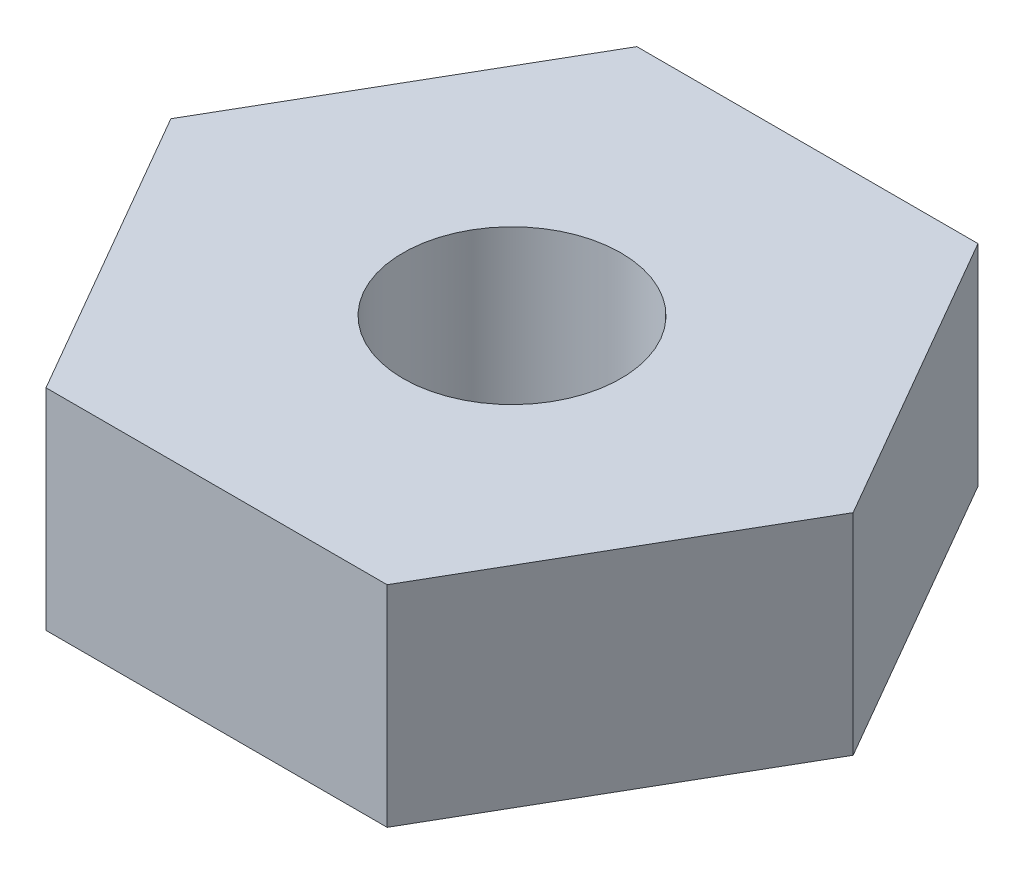
ISO-10303-21;
HEADER;
FILE_DESCRIPTION(('STEP AP214'),'2;1');
FILE_NAME('part.step','',(''),(''),'','','');
FILE_SCHEMA(('AUTOMOTIVE_DESIGN { 1 0 10303 214 1 1 1 1 }'));
ENDSEC;
DATA;
#1=APPLICATION_CONTEXT('core data for automotive mechanical design processes');
#2=APPLICATION_PROTOCOL_DEFINITION('international standard','automotive_design',2000,#1);
#3=PRODUCT_CONTEXT('',#1,'mechanical');
#4=PRODUCT('Part','Part','',(#3));
#5=PRODUCT_RELATED_PRODUCT_CATEGORY('part','',(#4));
#6=PRODUCT_DEFINITION_FORMATION('','',#4);
#7=PRODUCT_DEFINITION_CONTEXT('part definition',#1,'design');
#8=PRODUCT_DEFINITION('design','',#6,#7);
#9=PRODUCT_DEFINITION_SHAPE('','',#8);
#10=(LENGTH_UNIT() NAMED_UNIT(*) SI_UNIT(.MILLI.,.METRE.));
#11=(NAMED_UNIT(*) PLANE_ANGLE_UNIT() SI_UNIT($,.RADIAN.));
#12=(NAMED_UNIT(*) SI_UNIT($,.STERADIAN.) SOLID_ANGLE_UNIT());
#13=UNCERTAINTY_MEASURE_WITH_UNIT(LENGTH_MEASURE(1.E-05),#10,'distance_accuracy_value','');
#14=(GEOMETRIC_REPRESENTATION_CONTEXT(3) GLOBAL_UNCERTAINTY_ASSIGNED_CONTEXT((#13)) GLOBAL_UNIT_ASSIGNED_CONTEXT((#10,
#11,#12)) REPRESENTATION_CONTEXT('',''));
#15=CARTESIAN_POINT('',(0.,0.,0.));
#16=DIRECTION('',(0.,0.,1.));
#17=DIRECTION('',(1.,0.,0.));
#18=AXIS2_PLACEMENT_3D('',#15,#16,#17);
#19=CARTESIAN_POINT('',(2.24736479033408,2.7686,-3.89255));
#20=DIRECTION('',(0.,0.,1.));
#21=DIRECTION('',(1.,0.,0.));
#22=AXIS2_PLACEMENT_3D('',#19,#20,#21);
#23=PLANE('',#22);
#24=DIRECTION('',(-1.,0.,0.));
#25=VECTOR('',#24,1.);
#26=CARTESIAN_POINT('',(2.24736479033408,0.,-3.89255));
#27=LINE('',#26,#25);
#28=CARTESIAN_POINT('',(2.24736479033408,0.,-3.89255));
#29=VERTEX_POINT('',#28);
#30=CARTESIAN_POINT('',(-2.24736479033408,0.,-3.89255));
#31=VERTEX_POINT('',#30);
#32=EDGE_CURVE('E131',#29,#31,#27,.T.);
#33=ORIENTED_EDGE('',*,*,#32,.T.);
#34=DIRECTION('',(0.,-1.,0.));
#35=VECTOR('',#34,1.);
#36=CARTESIAN_POINT('',(-2.24736479033408,2.7686,-3.89255));
#37=LINE('',#36,#35);
#38=CARTESIAN_POINT('',(-2.24736479033408,2.7686,-3.89255));
#39=VERTEX_POINT('',#38);
#40=EDGE_CURVE('E13',#39,#31,#37,.T.);
#41=ORIENTED_EDGE('',*,*,#40,.F.);
#42=DIRECTION('',(-1.,0.,0.));
#43=VECTOR('',#42,1.);
#44=CARTESIAN_POINT('',(2.24736479033408,2.7686,-3.89255));
#45=LINE('',#44,#43);
#46=CARTESIAN_POINT('',(2.24736479033408,2.7686,-3.89255));
#47=VERTEX_POINT('',#46);
#48=EDGE_CURVE('E142',#47,#39,#45,.T.);
#49=ORIENTED_EDGE('',*,*,#48,.F.);
#50=DIRECTION('',(0.,-1.,0.));
#51=VECTOR('',#50,1.);
#52=CARTESIAN_POINT('',(2.24736479033408,2.7686,-3.89255));
#53=LINE('',#52,#51);
#54=EDGE_CURVE('E127',#47,#29,#53,.T.);
#55=ORIENTED_EDGE('',*,*,#54,.T.);
#56=EDGE_LOOP('',(#33,#41,#49,#55));
#57=FACE_BOUND('',#56,.T.);
#58=ADVANCED_FACE('F47',(#57),#23,.F.);
#59=CARTESIAN_POINT('',(-2.24736479033408,2.7686,-3.89255));
#60=DIRECTION('',(0.866025403784439,0.,0.5));
#61=DIRECTION('',(0.5,0.,-0.866025403784439));
#62=AXIS2_PLACEMENT_3D('',#59,#60,#61);
#63=PLANE('',#62);
#64=DIRECTION('',(-0.5,0.,0.866025403784439));
#65=VECTOR('',#64,1.);
#66=CARTESIAN_POINT('',(-2.24736479033408,0.,-3.89255));
#67=LINE('',#66,#65);
#68=CARTESIAN_POINT('',(-4.49472958066815,0.,0.));
#69=VERTEX_POINT('',#68);
#70=EDGE_CURVE('E134',#31,#69,#67,.T.);
#71=ORIENTED_EDGE('',*,*,#70,.T.);
#72=DIRECTION('',(0.,-1.,0.));
#73=VECTOR('',#72,1.);
#74=CARTESIAN_POINT('',(-4.49472958066815,2.7686,0.));
#75=LINE('',#74,#73);
#76=CARTESIAN_POINT('',(-4.49472958066815,2.7686,0.));
#77=VERTEX_POINT('',#76);
#78=EDGE_CURVE('E55',#77,#69,#75,.T.);
#79=ORIENTED_EDGE('',*,*,#78,.F.);
#80=DIRECTION('',(-0.5,0.,0.866025403784439));
#81=VECTOR('',#80,1.);
#82=CARTESIAN_POINT('',(-2.24736479033408,2.7686,-3.89255));
#83=LINE('',#82,#81);
#84=EDGE_CURVE('E100',#39,#77,#83,.T.);
#85=ORIENTED_EDGE('',*,*,#84,.F.);
#86=ORIENTED_EDGE('',*,*,#40,.T.);
#87=EDGE_LOOP('',(#71,#79,#85,#86));
#88=FACE_BOUND('',#87,.T.);
#89=ADVANCED_FACE('F167',(#88),#63,.F.);
#90=CARTESIAN_POINT('',(-4.49472958066815,2.7686,0.));
#91=DIRECTION('',(0.866025403784438,0.,-0.500000000000001));
#92=DIRECTION('',(-0.500000000000001,0.,-0.866025403784438));
#93=AXIS2_PLACEMENT_3D('',#90,#91,#92);
#94=PLANE('',#93);
#95=DIRECTION('',(0.500000000000001,0.,0.866025403784438));
#96=VECTOR('',#95,1.);
#97=CARTESIAN_POINT('',(-4.49472958066815,0.,0.));
#98=LINE('',#97,#96);
#99=CARTESIAN_POINT('',(-2.24736479033407,0.,3.89255));
#100=VERTEX_POINT('',#99);
#101=EDGE_CURVE('E137',#69,#100,#98,.T.);
#102=ORIENTED_EDGE('',*,*,#101,.T.);
#103=DIRECTION('',(0.,-1.,0.));
#104=VECTOR('',#103,1.);
#105=CARTESIAN_POINT('',(-2.24736479033407,2.7686,3.89255));
#106=LINE('',#105,#104);
#107=CARTESIAN_POINT('',(-2.24736479033407,2.7686,3.89255));
#108=VERTEX_POINT('',#107);
#109=EDGE_CURVE('E122',#108,#100,#106,.T.);
#110=ORIENTED_EDGE('',*,*,#109,.F.);
#111=DIRECTION('',(0.500000000000001,0.,0.866025403784438));
#112=VECTOR('',#111,1.);
#113=CARTESIAN_POINT('',(-4.49472958066815,2.7686,0.));
#114=LINE('',#113,#112);
#115=EDGE_CURVE('E113',#77,#108,#114,.T.);
#116=ORIENTED_EDGE('',*,*,#115,.F.);
#117=ORIENTED_EDGE('',*,*,#78,.T.);
#118=EDGE_LOOP('',(#102,#110,#116,#117));
#119=FACE_BOUND('',#118,.T.);
#120=ADVANCED_FACE('F148',(#119),#94,.F.);
#121=CARTESIAN_POINT('',(-2.24736479033407,2.7686,3.89255));
#122=DIRECTION('',(0.,0.,-1.));
#123=DIRECTION('',(-1.,0.,0.));
#124=AXIS2_PLACEMENT_3D('',#121,#122,#123);
#125=PLANE('',#124);
#126=DIRECTION('',(1.,0.,0.));
#127=VECTOR('',#126,1.);
#128=CARTESIAN_POINT('',(-2.24736479033407,0.,3.89255));
#129=LINE('',#128,#127);
#130=CARTESIAN_POINT('',(2.24736479033408,0.,3.89255));
#131=VERTEX_POINT('',#130);
#132=EDGE_CURVE('E121',#100,#131,#129,.T.);
#133=ORIENTED_EDGE('',*,*,#132,.T.);
#134=DIRECTION('',(0.,-1.,0.));
#135=VECTOR('',#134,1.);
#136=CARTESIAN_POINT('',(2.24736479033408,2.7686,3.89255));
#137=LINE('',#136,#135);
#138=CARTESIAN_POINT('',(2.24736479033408,2.7686,3.89255));
#139=VERTEX_POINT('',#138);
#140=EDGE_CURVE('E118',#139,#131,#137,.T.);
#141=ORIENTED_EDGE('',*,*,#140,.F.);
#142=DIRECTION('',(1.,0.,0.));
#143=VECTOR('',#142,1.);
#144=CARTESIAN_POINT('',(-2.24736479033407,2.7686,3.89255));
#145=LINE('',#144,#143);
#146=EDGE_CURVE('E107',#108,#139,#145,.T.);
#147=ORIENTED_EDGE('',*,*,#146,.F.);
#148=ORIENTED_EDGE('',*,*,#109,.T.);
#149=EDGE_LOOP('',(#133,#141,#147,#148));
#150=FACE_BOUND('',#149,.T.);
#151=ADVANCED_FACE('F119',(#150),#125,.F.);
#152=CARTESIAN_POINT('',(2.24736479033408,2.7686,3.89255));
#153=DIRECTION('',(-0.866025403784439,0.,-0.5));
#154=DIRECTION('',(-0.5,0.,0.866025403784439));
#155=AXIS2_PLACEMENT_3D('',#152,#153,#154);
#156=PLANE('',#155);
#157=DIRECTION('',(0.5,0.,-0.866025403784439));
#158=VECTOR('',#157,1.);
#159=CARTESIAN_POINT('',(2.24736479033408,0.,3.89255));
#160=LINE('',#159,#158);
#161=CARTESIAN_POINT('',(4.49472958066815,0.,0.));
#162=VERTEX_POINT('',#161);
#163=EDGE_CURVE('E86',#131,#162,#160,.T.);
#164=ORIENTED_EDGE('',*,*,#163,.T.);
#165=DIRECTION('',(0.,-1.,0.));
#166=VECTOR('',#165,1.);
#167=CARTESIAN_POINT('',(4.49472958066815,2.7686,0.));
#168=LINE('',#167,#166);
#169=CARTESIAN_POINT('',(4.49472958066815,2.7686,0.));
#170=VERTEX_POINT('',#169);
#171=EDGE_CURVE('E123',#170,#162,#168,.T.);
#172=ORIENTED_EDGE('',*,*,#171,.F.);
#173=DIRECTION('',(0.5,0.,-0.866025403784439));
#174=VECTOR('',#173,1.);
#175=CARTESIAN_POINT('',(2.24736479033408,2.7686,3.89255));
#176=LINE('',#175,#174);
#177=EDGE_CURVE('E111',#139,#170,#176,.T.);
#178=ORIENTED_EDGE('',*,*,#177,.F.);
#179=ORIENTED_EDGE('',*,*,#140,.T.);
#180=EDGE_LOOP('',(#164,#172,#178,#179));
#181=FACE_BOUND('',#180,.T.);
#182=ADVANCED_FACE('F125',(#181),#156,.F.);
#183=CARTESIAN_POINT('',(4.49472958066815,2.7686,0.));
#184=DIRECTION('',(-0.866025403784439,0.,0.5));
#185=DIRECTION('',(0.5,0.,0.866025403784439));
#186=AXIS2_PLACEMENT_3D('',#183,#184,#185);
#187=PLANE('',#186);
#188=DIRECTION('',(-0.5,0.,-0.866025403784439));
#189=VECTOR('',#188,1.);
#190=CARTESIAN_POINT('',(4.49472958066815,0.,0.));
#191=LINE('',#190,#189);
#192=EDGE_CURVE('E92',#162,#29,#191,.T.);
#193=ORIENTED_EDGE('',*,*,#192,.T.);
#194=ORIENTED_EDGE('',*,*,#54,.F.);
#195=DIRECTION('',(-0.5,0.,-0.866025403784439));
#196=VECTOR('',#195,1.);
#197=CARTESIAN_POINT('',(4.49472958066815,2.7686,0.));
#198=LINE('',#197,#196);
#199=EDGE_CURVE('E63',#170,#47,#198,.T.);
#200=ORIENTED_EDGE('',*,*,#199,.F.);
#201=ORIENTED_EDGE('',*,*,#171,.T.);
#202=EDGE_LOOP('',(#193,#194,#200,#201));
#203=FACE_BOUND('',#202,.T.);
#204=ADVANCED_FACE('F155',(#203),#187,.F.);
#205=CARTESIAN_POINT('',(0.,2.7686,0.));
#206=DIRECTION('',(0.,1.,0.));
#207=DIRECTION('',(0.,0.,1.));
#208=AXIS2_PLACEMENT_3D('',#205,#206,#207);
#209=PLANE('',#208);
#210=CARTESIAN_POINT('',(0.,2.7686,0.));
#211=DIRECTION('',(0.,1.,0.));
#212=DIRECTION('',(0.,0.,1.));
#213=AXIS2_PLACEMENT_3D('',#210,#211,#212);
#214=CIRCLE('',#213,1.4351);
#215=CARTESIAN_POINT('',(0.,2.7686,1.4351));
#216=VERTEX_POINT('',#215);
#217=EDGE_CURVE('E135',#216,#216,#214,.T.);
#218=ORIENTED_EDGE('',*,*,#217,.F.);
#219=EDGE_LOOP('',(#218));
#220=FACE_BOUND('',#219,.T.);
#221=ORIENTED_EDGE('',*,*,#48,.T.);
#222=ORIENTED_EDGE('',*,*,#84,.T.);
#223=ORIENTED_EDGE('',*,*,#115,.T.);
#224=ORIENTED_EDGE('',*,*,#146,.T.);
#225=ORIENTED_EDGE('',*,*,#177,.T.);
#226=ORIENTED_EDGE('',*,*,#199,.T.);
#227=EDGE_LOOP('',(#221,#222,#223,#224,#225,#226));
#228=FACE_BOUND('',#227,.T.);
#229=ADVANCED_FACE('F109',(#220,#228),#209,.T.);
#230=CARTESIAN_POINT('',(0.,0.,0.));
#231=DIRECTION('',(0.,1.,0.));
#232=DIRECTION('',(0.,0.,1.));
#233=AXIS2_PLACEMENT_3D('',#230,#231,#232);
#234=PLANE('',#233);
#235=CARTESIAN_POINT('',(0.,0.,0.));
#236=DIRECTION('',(0.,1.,0.));
#237=DIRECTION('',(0.,0.,1.));
#238=AXIS2_PLACEMENT_3D('',#235,#236,#237);
#239=CIRCLE('',#238,1.4351);
#240=CARTESIAN_POINT('',(0.,0.,1.4351));
#241=VERTEX_POINT('',#240);
#242=EDGE_CURVE('E222',#241,#241,#239,.T.);
#243=ORIENTED_EDGE('',*,*,#242,.T.);
#244=EDGE_LOOP('',(#243));
#245=FACE_BOUND('',#244,.T.);
#246=ORIENTED_EDGE('',*,*,#32,.F.);
#247=ORIENTED_EDGE('',*,*,#192,.F.);
#248=ORIENTED_EDGE('',*,*,#163,.F.);
#249=ORIENTED_EDGE('',*,*,#132,.F.);
#250=ORIENTED_EDGE('',*,*,#101,.F.);
#251=ORIENTED_EDGE('',*,*,#70,.F.);
#252=EDGE_LOOP('',(#246,#247,#248,#249,#250,#251));
#253=FACE_BOUND('',#252,.T.);
#254=ADVANCED_FACE('F151',(#245,#253),#234,.F.);
#255=CARTESIAN_POINT('',(0.,2.7686,0.));
#256=DIRECTION('',(0.,-1.,0.));
#257=DIRECTION('',(0.,0.,-1.));
#258=AXIS2_PLACEMENT_3D('',#255,#256,#257);
#259=CYLINDRICAL_SURFACE('',#258,1.4351);
#260=ORIENTED_EDGE('',*,*,#217,.T.);
#261=EDGE_LOOP('',(#260));
#262=FACE_BOUND('',#261,.T.);
#263=ORIENTED_EDGE('',*,*,#242,.F.);
#264=EDGE_LOOP('',(#263));
#265=FACE_BOUND('',#264,.T.);
#266=ADVANCED_FACE('F204',(#262,#265),#259,.F.);
#267=CLOSED_SHELL('',(#58,#89,#120,#151,#182,#204,#229,#254,#266));
#268=MANIFOLD_SOLID_BREP('B2',#267);
#269=ADVANCED_BREP_SHAPE_REPRESENTATION('',(#18,#268),#14);
#270=SHAPE_DEFINITION_REPRESENTATION(#9,#269);
ENDSEC;
END-ISO-10303-21;
